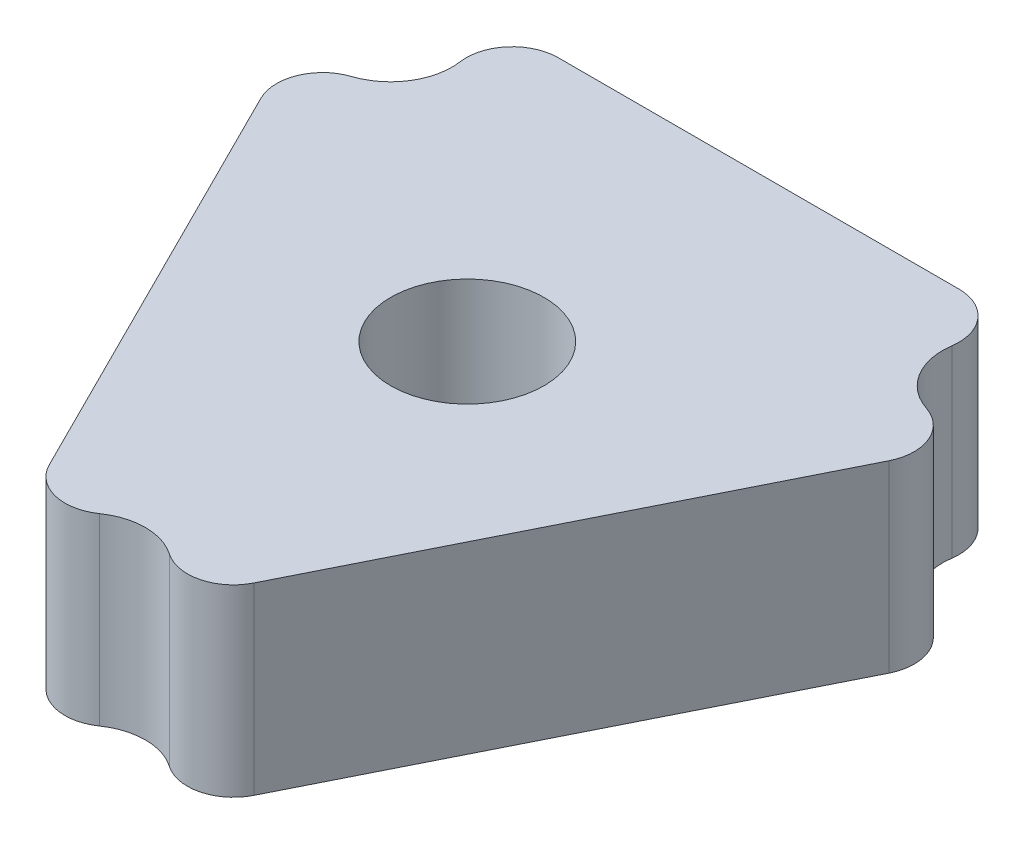
ISO-10303-21;
HEADER;
FILE_DESCRIPTION(('STEP AP214'),'2;1');
FILE_NAME('part.step','',(''),(''),'','','');
FILE_SCHEMA(('AUTOMOTIVE_DESIGN { 1 0 10303 214 1 1 1 1 }'));
ENDSEC;
DATA;
#1=APPLICATION_CONTEXT('core data for automotive mechanical design processes');
#2=APPLICATION_PROTOCOL_DEFINITION('international standard','automotive_design',2000,#1);
#3=PRODUCT_CONTEXT('',#1,'mechanical');
#4=PRODUCT('Part','Part','',(#3));
#5=PRODUCT_RELATED_PRODUCT_CATEGORY('part','',(#4));
#6=PRODUCT_DEFINITION_FORMATION('','',#4);
#7=PRODUCT_DEFINITION_CONTEXT('part definition',#1,'design');
#8=PRODUCT_DEFINITION('design','',#6,#7);
#9=PRODUCT_DEFINITION_SHAPE('','',#8);
#10=(LENGTH_UNIT() NAMED_UNIT(*) SI_UNIT(.MILLI.,.METRE.));
#11=(NAMED_UNIT(*) PLANE_ANGLE_UNIT() SI_UNIT($,.RADIAN.));
#12=(NAMED_UNIT(*) SI_UNIT($,.STERADIAN.) SOLID_ANGLE_UNIT());
#13=UNCERTAINTY_MEASURE_WITH_UNIT(LENGTH_MEASURE(1.E-05),#10,'distance_accuracy_value','');
#14=(GEOMETRIC_REPRESENTATION_CONTEXT(3) GLOBAL_UNCERTAINTY_ASSIGNED_CONTEXT((#13)) GLOBAL_UNIT_ASSIGNED_CONTEXT((#10,
#11,#12)) REPRESENTATION_CONTEXT('',''));
#15=CARTESIAN_POINT('',(0.,0.,0.));
#16=DIRECTION('',(0.,0.,1.));
#17=DIRECTION('',(1.,0.,0.));
#18=AXIS2_PLACEMENT_3D('',#15,#16,#17);
#19=CARTESIAN_POINT('',(-3.99281386796585,12.,19.2504402415681));
#20=DIRECTION('',(0.,1.,0.));
#21=DIRECTION('',(0.,0.,1.));
#22=AXIS2_PLACEMENT_3D('',#19,#20,#21);
#23=PLANE('',#22);
#24=CARTESIAN_POINT('',(-3.99281386796585,12.,19.2504402415681));
#25=DIRECTION('',(0.,1.,0.));
#26=DIRECTION('',(0.,0.,1.));
#27=AXIS2_PLACEMENT_3D('',#24,#25,#26);
#28=CIRCLE('',#27,3.);
#29=CARTESIAN_POINT('',(-6.67609544096559,12.,20.592081028068));
#30=VERTEX_POINT('',#29);
#31=CARTESIAN_POINT('',(-2.28160792455191,12.,21.7145372808961));
#32=VERTEX_POINT('',#31);
#33=EDGE_CURVE('E189',#30,#32,#28,.T.);
#34=ORIENTED_EDGE('',*,*,#33,.T.);
#35=CARTESIAN_POINT('',(0.,12.,25.));
#36=DIRECTION('',(0.,-1.,0.));
#37=DIRECTION('',(0.,0.,1.));
#38=AXIS2_PLACEMENT_3D('',#35,#36,#37);
#39=CIRCLE('',#38,4.);
#40=CARTESIAN_POINT('',(2.28160792455191,12.,21.7145372808961));
#41=VERTEX_POINT('',#40);
#42=EDGE_CURVE('E117',#32,#41,#39,.T.);
#43=ORIENTED_EDGE('',*,*,#42,.T.);
#44=CARTESIAN_POINT('',(3.99281386796585,12.,19.2504402415681));
#45=DIRECTION('',(0.,1.,0.));
#46=DIRECTION('',(0.,0.,-1.));
#47=AXIS2_PLACEMENT_3D('',#44,#45,#46);
#48=CIRCLE('',#47,3.);
#49=CARTESIAN_POINT('',(6.6760954409656,12.,20.592081028068));
#50=VERTEX_POINT('',#49);
#51=EDGE_CURVE('E216',#41,#50,#48,.T.);
#52=ORIENTED_EDGE('',*,*,#51,.T.);
#53=DIRECTION('',(0.447213595499958,0.,-0.894427190999916));
#54=VECTOR('',#53,1.);
#55=CARTESIAN_POINT('',(6.6760954409656,12.,20.592081028068));
#56=LINE('',#55,#54);
#57=CARTESIAN_POINT('',(20.4793220870337,12.,-7.0143722640683));
#58=VERTEX_POINT('',#57);
#59=EDGE_CURVE('E235',#50,#58,#56,.T.);
#60=ORIENTED_EDGE('',*,*,#59,.T.);
#61=CARTESIAN_POINT('',(17.796040514034,12.,-8.35601305056818));
#62=DIRECTION('',(0.,1.,0.));
#63=DIRECTION('',(0.,0.,-1.));
#64=AXIS2_PLACEMENT_3D('',#61,#62,#63);
#65=CIRCLE('',#64,3.);
#66=CARTESIAN_POINT('',(18.740594579448,12.,-11.2034360288961));
#67=VERTEX_POINT('',#66);
#68=EDGE_CURVE('E232',#58,#67,#65,.T.);
#69=ORIENTED_EDGE('',*,*,#68,.T.);
#70=CARTESIAN_POINT('',(20.,12.,-15.));
#71=DIRECTION('',(0.,-1.,0.));
#72=DIRECTION('',(0.,0.,1.));
#73=AXIS2_PLACEMENT_3D('',#70,#71,#72);
#74=CIRCLE('',#73,4.);
#75=CARTESIAN_POINT('',(16.0410267255568,12.,-15.5714285714286));
#76=VERTEX_POINT('',#75);
#77=EDGE_CURVE('E234',#67,#76,#74,.T.);
#78=ORIENTED_EDGE('',*,*,#77,.T.);
#79=CARTESIAN_POINT('',(13.0717967697245,12.,-16.));
#80=DIRECTION('',(0.,1.,0.));
#81=DIRECTION('',(0.,0.,-1.));
#82=AXIS2_PLACEMENT_3D('',#79,#80,#81);
#83=CIRCLE('',#82,3.);
#84=CARTESIAN_POINT('',(13.0717967697245,12.,-19.));
#85=VERTEX_POINT('',#84);
#86=EDGE_CURVE('E237',#76,#85,#83,.T.);
#87=ORIENTED_EDGE('',*,*,#86,.T.);
#88=DIRECTION('',(-1.,0.,0.));
#89=VECTOR('',#88,1.);
#90=CARTESIAN_POINT('',(13.0717967697245,12.,-19.));
#91=LINE('',#90,#89);
#92=CARTESIAN_POINT('',(-13.0717967697245,12.,-19.));
#93=VERTEX_POINT('',#92);
#94=EDGE_CURVE('E243',#85,#93,#91,.T.);
#95=ORIENTED_EDGE('',*,*,#94,.T.);
#96=CARTESIAN_POINT('',(-13.0717967697245,12.,-16.));
#97=DIRECTION('',(0.,1.,0.));
#98=DIRECTION('',(0.,0.,1.));
#99=AXIS2_PLACEMENT_3D('',#96,#97,#98);
#100=CIRCLE('',#99,3.);
#101=CARTESIAN_POINT('',(-16.0410267255569,12.,-15.5714285714286));
#102=VERTEX_POINT('',#101);
#103=EDGE_CURVE('E148',#93,#102,#100,.T.);
#104=ORIENTED_EDGE('',*,*,#103,.T.);
#105=CARTESIAN_POINT('',(-20.,12.,-15.));
#106=DIRECTION('',(0.,-1.,0.));
#107=DIRECTION('',(0.,0.,1.));
#108=AXIS2_PLACEMENT_3D('',#105,#106,#107);
#109=CIRCLE('',#108,4.);
#110=CARTESIAN_POINT('',(-18.740594579448,12.,-11.2034360288961));
#111=VERTEX_POINT('',#110);
#112=EDGE_CURVE('E142',#102,#111,#109,.T.);
#113=ORIENTED_EDGE('',*,*,#112,.T.);
#114=CARTESIAN_POINT('',(-17.796040514034,12.,-8.35601305056818));
#115=DIRECTION('',(0.,1.,0.));
#116=DIRECTION('',(0.,0.,-1.));
#117=AXIS2_PLACEMENT_3D('',#114,#115,#116);
#118=CIRCLE('',#117,3.);
#119=CARTESIAN_POINT('',(-20.4793220870337,12.,-7.0143722640683));
#120=VERTEX_POINT('',#119);
#121=EDGE_CURVE('E146',#111,#120,#118,.T.);
#122=ORIENTED_EDGE('',*,*,#121,.T.);
#123=DIRECTION('',(0.447213595499958,0.,0.894427190999916));
#124=VECTOR('',#123,1.);
#125=CARTESIAN_POINT('',(-20.4793220870337,12.,-7.0143722640683));
#126=LINE('',#125,#124);
#127=EDGE_CURVE('E62',#120,#30,#126,.T.);
#128=ORIENTED_EDGE('',*,*,#127,.T.);
#129=EDGE_LOOP('',(#34,#43,#52,#60,#69,#78,#87,#95,#104,#113,#122,#128));
#130=FACE_BOUND('',#129,.T.);
#131=CARTESIAN_POINT('',(0.,12.,0.));
#132=DIRECTION('',(0.,1.,0.));
#133=DIRECTION('',(0.,0.,1.));
#134=AXIS2_PLACEMENT_3D('',#131,#132,#133);
#135=CIRCLE('',#134,5.);
#136=CARTESIAN_POINT('',(0.,12.,5.));
#137=VERTEX_POINT('',#136);
#138=EDGE_CURVE('E170',#137,#137,#135,.T.);
#139=ORIENTED_EDGE('',*,*,#138,.F.);
#140=EDGE_LOOP('',(#139));
#141=FACE_BOUND('',#140,.T.);
#142=ADVANCED_FACE('F45',(#130,#141),#23,.T.);
#143=CARTESIAN_POINT('',(-3.99281386796585,0.,19.2504402415681));
#144=DIRECTION('',(0.,1.,0.));
#145=DIRECTION('',(0.,0.,1.));
#146=AXIS2_PLACEMENT_3D('',#143,#144,#145);
#147=PLANE('',#146);
#148=CARTESIAN_POINT('',(-3.99281386796585,0.,19.2504402415681));
#149=DIRECTION('',(0.,1.,0.));
#150=DIRECTION('',(0.,0.,1.));
#151=AXIS2_PLACEMENT_3D('',#148,#149,#150);
#152=CIRCLE('',#151,3.);
#153=CARTESIAN_POINT('',(-6.67609544096559,0.,20.592081028068));
#154=VERTEX_POINT('',#153);
#155=CARTESIAN_POINT('',(-2.28160792455191,0.,21.7145372808961));
#156=VERTEX_POINT('',#155);
#157=EDGE_CURVE('E166',#154,#156,#152,.T.);
#158=ORIENTED_EDGE('',*,*,#157,.F.);
#159=DIRECTION('',(0.447213595499958,0.,0.894427190999916));
#160=VECTOR('',#159,1.);
#161=CARTESIAN_POINT('',(-20.4793220870337,0.,-7.0143722640683));
#162=LINE('',#161,#160);
#163=CARTESIAN_POINT('',(-20.4793220870337,0.,-7.0143722640683));
#164=VERTEX_POINT('',#163);
#165=EDGE_CURVE('E109',#164,#154,#162,.T.);
#166=ORIENTED_EDGE('',*,*,#165,.F.);
#167=CARTESIAN_POINT('',(-17.796040514034,0.,-8.35601305056818));
#168=DIRECTION('',(0.,1.,0.));
#169=DIRECTION('',(0.,0.,-1.));
#170=AXIS2_PLACEMENT_3D('',#167,#168,#169);
#171=CIRCLE('',#170,3.);
#172=CARTESIAN_POINT('',(-18.740594579448,0.,-11.2034360288961));
#173=VERTEX_POINT('',#172);
#174=EDGE_CURVE('E103',#173,#164,#171,.T.);
#175=ORIENTED_EDGE('',*,*,#174,.F.);
#176=CARTESIAN_POINT('',(-20.,0.,-15.));
#177=DIRECTION('',(0.,-1.,0.));
#178=DIRECTION('',(0.,0.,1.));
#179=AXIS2_PLACEMENT_3D('',#176,#177,#178);
#180=CIRCLE('',#179,4.);
#181=CARTESIAN_POINT('',(-16.0410267255569,0.,-15.5714285714286));
#182=VERTEX_POINT('',#181);
#183=EDGE_CURVE('E156',#182,#173,#180,.T.);
#184=ORIENTED_EDGE('',*,*,#183,.F.);
#185=CARTESIAN_POINT('',(-13.0717967697245,0.,-16.));
#186=DIRECTION('',(0.,1.,0.));
#187=DIRECTION('',(0.,0.,1.));
#188=AXIS2_PLACEMENT_3D('',#185,#186,#187);
#189=CIRCLE('',#188,3.);
#190=CARTESIAN_POINT('',(-13.0717967697245,0.,-19.));
#191=VERTEX_POINT('',#190);
#192=EDGE_CURVE('E184',#191,#182,#189,.T.);
#193=ORIENTED_EDGE('',*,*,#192,.F.);
#194=DIRECTION('',(-1.,0.,0.));
#195=VECTOR('',#194,1.);
#196=CARTESIAN_POINT('',(13.0717967697245,0.,-19.));
#197=LINE('',#196,#195);
#198=CARTESIAN_POINT('',(13.0717967697245,0.,-19.));
#199=VERTEX_POINT('',#198);
#200=EDGE_CURVE('E182',#199,#191,#197,.T.);
#201=ORIENTED_EDGE('',*,*,#200,.F.);
#202=CARTESIAN_POINT('',(13.0717967697245,0.,-16.));
#203=DIRECTION('',(0.,1.,0.));
#204=DIRECTION('',(0.,0.,-1.));
#205=AXIS2_PLACEMENT_3D('',#202,#203,#204);
#206=CIRCLE('',#205,3.);
#207=CARTESIAN_POINT('',(16.0410267255568,0.,-15.5714285714286));
#208=VERTEX_POINT('',#207);
#209=EDGE_CURVE('E180',#208,#199,#206,.T.);
#210=ORIENTED_EDGE('',*,*,#209,.F.);
#211=CARTESIAN_POINT('',(20.,0.,-15.));
#212=DIRECTION('',(0.,-1.,0.));
#213=DIRECTION('',(0.,0.,1.));
#214=AXIS2_PLACEMENT_3D('',#211,#212,#213);
#215=CIRCLE('',#214,4.);
#216=CARTESIAN_POINT('',(18.740594579448,0.,-11.2034360288961));
#217=VERTEX_POINT('',#216);
#218=EDGE_CURVE('E178',#217,#208,#215,.T.);
#219=ORIENTED_EDGE('',*,*,#218,.F.);
#220=CARTESIAN_POINT('',(17.796040514034,0.,-8.35601305056818));
#221=DIRECTION('',(0.,1.,0.));
#222=DIRECTION('',(0.,0.,-1.));
#223=AXIS2_PLACEMENT_3D('',#220,#221,#222);
#224=CIRCLE('',#223,3.);
#225=CARTESIAN_POINT('',(20.4793220870337,0.,-7.0143722640683));
#226=VERTEX_POINT('',#225);
#227=EDGE_CURVE('E176',#226,#217,#224,.T.);
#228=ORIENTED_EDGE('',*,*,#227,.F.);
#229=DIRECTION('',(0.447213595499958,0.,-0.894427190999916));
#230=VECTOR('',#229,1.);
#231=CARTESIAN_POINT('',(6.6760954409656,0.,20.592081028068));
#232=LINE('',#231,#230);
#233=CARTESIAN_POINT('',(6.6760954409656,0.,20.592081028068));
#234=VERTEX_POINT('',#233);
#235=EDGE_CURVE('E174',#234,#226,#232,.T.);
#236=ORIENTED_EDGE('',*,*,#235,.F.);
#237=CARTESIAN_POINT('',(3.99281386796585,0.,19.2504402415681));
#238=DIRECTION('',(0.,1.,0.));
#239=DIRECTION('',(0.,0.,-1.));
#240=AXIS2_PLACEMENT_3D('',#237,#238,#239);
#241=CIRCLE('',#240,3.);
#242=CARTESIAN_POINT('',(2.28160792455191,0.,21.7145372808961));
#243=VERTEX_POINT('',#242);
#244=EDGE_CURVE('E172',#243,#234,#241,.T.);
#245=ORIENTED_EDGE('',*,*,#244,.F.);
#246=CARTESIAN_POINT('',(0.,0.,25.));
#247=DIRECTION('',(0.,-1.,0.));
#248=DIRECTION('',(0.,0.,1.));
#249=AXIS2_PLACEMENT_3D('',#246,#247,#248);
#250=CIRCLE('',#249,4.);
#251=EDGE_CURVE('E169',#156,#243,#250,.T.);
#252=ORIENTED_EDGE('',*,*,#251,.F.);
#253=EDGE_LOOP('',(#158,#166,#175,#184,#193,#201,#210,#219,#228,#236,#245,#252));
#254=FACE_BOUND('',#253,.T.);
#255=CARTESIAN_POINT('',(0.,0.,0.));
#256=DIRECTION('',(0.,1.,0.));
#257=DIRECTION('',(0.,0.,1.));
#258=AXIS2_PLACEMENT_3D('',#255,#256,#257);
#259=CIRCLE('',#258,5.);
#260=CARTESIAN_POINT('',(0.,0.,5.));
#261=VERTEX_POINT('',#260);
#262=EDGE_CURVE('E408',#261,#261,#259,.T.);
#263=ORIENTED_EDGE('',*,*,#262,.T.);
#264=EDGE_LOOP('',(#263));
#265=FACE_BOUND('',#264,.T.);
#266=ADVANCED_FACE('F220',(#254,#265),#147,.F.);
#267=CARTESIAN_POINT('',(-3.99281386796585,12.,19.2504402415681));
#268=DIRECTION('',(0.,-1.,0.));
#269=DIRECTION('',(0.,0.,-1.));
#270=AXIS2_PLACEMENT_3D('',#267,#268,#269);
#271=CYLINDRICAL_SURFACE('',#270,3.);
#272=ORIENTED_EDGE('',*,*,#157,.T.);
#273=DIRECTION('',(0.,-1.,0.));
#274=VECTOR('',#273,1.);
#275=CARTESIAN_POINT('',(-2.28160792455191,12.,21.7145372808961));
#276=LINE('',#275,#274);
#277=EDGE_CURVE('E13',#32,#156,#276,.T.);
#278=ORIENTED_EDGE('',*,*,#277,.F.);
#279=ORIENTED_EDGE('',*,*,#33,.F.);
#280=DIRECTION('',(0.,-1.,0.));
#281=VECTOR('',#280,1.);
#282=CARTESIAN_POINT('',(-6.67609544096559,12.,20.592081028068));
#283=LINE('',#282,#281);
#284=EDGE_CURVE('E162',#30,#154,#283,.T.);
#285=ORIENTED_EDGE('',*,*,#284,.T.);
#286=EDGE_LOOP('',(#272,#278,#279,#285));
#287=FACE_BOUND('',#286,.T.);
#288=ADVANCED_FACE('F47',(#287),#271,.T.);
#289=CARTESIAN_POINT('',(0.,12.,25.));
#290=DIRECTION('',(0.,-1.,0.));
#291=DIRECTION('',(0.,0.,-1.));
#292=AXIS2_PLACEMENT_3D('',#289,#290,#291);
#293=CYLINDRICAL_SURFACE('',#292,4.);
#294=ORIENTED_EDGE('',*,*,#251,.T.);
#295=DIRECTION('',(0.,-1.,0.));
#296=VECTOR('',#295,1.);
#297=CARTESIAN_POINT('',(2.28160792455191,12.,21.7145372808961));
#298=LINE('',#297,#296);
#299=EDGE_CURVE('E54',#41,#243,#298,.T.);
#300=ORIENTED_EDGE('',*,*,#299,.F.);
#301=ORIENTED_EDGE('',*,*,#42,.F.);
#302=ORIENTED_EDGE('',*,*,#277,.T.);
#303=EDGE_LOOP('',(#294,#300,#301,#302));
#304=FACE_BOUND('',#303,.T.);
#305=ADVANCED_FACE('F277',(#304),#293,.F.);
#306=CARTESIAN_POINT('',(3.99281386796585,12.,19.2504402415681));
#307=DIRECTION('',(0.,-1.,0.));
#308=DIRECTION('',(0.,0.,-1.));
#309=AXIS2_PLACEMENT_3D('',#306,#307,#308);
#310=CYLINDRICAL_SURFACE('',#309,3.);
#311=ORIENTED_EDGE('',*,*,#244,.T.);
#312=DIRECTION('',(0.,-1.,0.));
#313=VECTOR('',#312,1.);
#314=CARTESIAN_POINT('',(6.6760954409656,12.,20.592081028068));
#315=LINE('',#314,#313);
#316=EDGE_CURVE('E208',#50,#234,#315,.T.);
#317=ORIENTED_EDGE('',*,*,#316,.F.);
#318=ORIENTED_EDGE('',*,*,#51,.F.);
#319=ORIENTED_EDGE('',*,*,#299,.T.);
#320=EDGE_LOOP('',(#311,#317,#318,#319));
#321=FACE_BOUND('',#320,.T.);
#322=ADVANCED_FACE('F214',(#321),#310,.T.);
#323=CARTESIAN_POINT('',(6.6760954409656,12.,20.592081028068));
#324=DIRECTION('',(-0.894427190999916,0.,-0.447213595499958));
#325=DIRECTION('',(-0.447213595499958,0.,0.894427190999916));
#326=AXIS2_PLACEMENT_3D('',#323,#324,#325);
#327=PLANE('',#326);
#328=ORIENTED_EDGE('',*,*,#235,.T.);
#329=DIRECTION('',(0.,-1.,0.));
#330=VECTOR('',#329,1.);
#331=CARTESIAN_POINT('',(20.4793220870337,12.,-7.0143722640683));
#332=LINE('',#331,#330);
#333=EDGE_CURVE('E205',#58,#226,#332,.T.);
#334=ORIENTED_EDGE('',*,*,#333,.F.);
#335=ORIENTED_EDGE('',*,*,#59,.F.);
#336=ORIENTED_EDGE('',*,*,#316,.T.);
#337=EDGE_LOOP('',(#328,#334,#335,#336));
#338=FACE_BOUND('',#337,.T.);
#339=ADVANCED_FACE('F226',(#338),#327,.F.);
#340=CARTESIAN_POINT('',(17.796040514034,12.,-8.35601305056818));
#341=DIRECTION('',(0.,-1.,0.));
#342=DIRECTION('',(0.,0.,-1.));
#343=AXIS2_PLACEMENT_3D('',#340,#341,#342);
#344=CYLINDRICAL_SURFACE('',#343,3.);
#345=ORIENTED_EDGE('',*,*,#227,.T.);
#346=DIRECTION('',(0.,-1.,0.));
#347=VECTOR('',#346,1.);
#348=CARTESIAN_POINT('',(18.740594579448,12.,-11.2034360288961));
#349=LINE('',#348,#347);
#350=EDGE_CURVE('E202',#67,#217,#349,.T.);
#351=ORIENTED_EDGE('',*,*,#350,.F.);
#352=ORIENTED_EDGE('',*,*,#68,.F.);
#353=ORIENTED_EDGE('',*,*,#333,.T.);
#354=EDGE_LOOP('',(#345,#351,#352,#353));
#355=FACE_BOUND('',#354,.T.);
#356=ADVANCED_FACE('F230',(#355),#344,.T.);
#357=CARTESIAN_POINT('',(20.,12.,-15.));
#358=DIRECTION('',(0.,-1.,0.));
#359=DIRECTION('',(0.,0.,-1.));
#360=AXIS2_PLACEMENT_3D('',#357,#358,#359);
#361=CYLINDRICAL_SURFACE('',#360,4.);
#362=ORIENTED_EDGE('',*,*,#218,.T.);
#363=DIRECTION('',(0.,-1.,0.));
#364=VECTOR('',#363,1.);
#365=CARTESIAN_POINT('',(16.0410267255568,12.,-15.5714285714286));
#366=LINE('',#365,#364);
#367=EDGE_CURVE('E199',#76,#208,#366,.T.);
#368=ORIENTED_EDGE('',*,*,#367,.F.);
#369=ORIENTED_EDGE('',*,*,#77,.F.);
#370=ORIENTED_EDGE('',*,*,#350,.T.);
#371=EDGE_LOOP('',(#362,#368,#369,#370));
#372=FACE_BOUND('',#371,.T.);
#373=ADVANCED_FACE('F290',(#372),#361,.F.);
#374=CARTESIAN_POINT('',(13.0717967697245,12.,-16.));
#375=DIRECTION('',(0.,-1.,0.));
#376=DIRECTION('',(0.,0.,-1.));
#377=AXIS2_PLACEMENT_3D('',#374,#375,#376);
#378=CYLINDRICAL_SURFACE('',#377,3.);
#379=ORIENTED_EDGE('',*,*,#209,.T.);
#380=DIRECTION('',(0.,-1.,0.));
#381=VECTOR('',#380,1.);
#382=CARTESIAN_POINT('',(13.0717967697245,12.,-19.));
#383=LINE('',#382,#381);
#384=EDGE_CURVE('E196',#85,#199,#383,.T.);
#385=ORIENTED_EDGE('',*,*,#384,.F.);
#386=ORIENTED_EDGE('',*,*,#86,.F.);
#387=ORIENTED_EDGE('',*,*,#367,.T.);
#388=EDGE_LOOP('',(#379,#385,#386,#387));
#389=FACE_BOUND('',#388,.T.);
#390=ADVANCED_FACE('F293',(#389),#378,.T.);
#391=CARTESIAN_POINT('',(13.0717967697245,12.,-19.));
#392=DIRECTION('',(0.,0.,1.));
#393=DIRECTION('',(1.,0.,0.));
#394=AXIS2_PLACEMENT_3D('',#391,#392,#393);
#395=PLANE('',#394);
#396=ORIENTED_EDGE('',*,*,#200,.T.);
#397=DIRECTION('',(0.,-1.,0.));
#398=VECTOR('',#397,1.);
#399=CARTESIAN_POINT('',(-13.0717967697245,12.,-19.));
#400=LINE('',#399,#398);
#401=EDGE_CURVE('E193',#93,#191,#400,.T.);
#402=ORIENTED_EDGE('',*,*,#401,.F.);
#403=ORIENTED_EDGE('',*,*,#94,.F.);
#404=ORIENTED_EDGE('',*,*,#384,.T.);
#405=EDGE_LOOP('',(#396,#402,#403,#404));
#406=FACE_BOUND('',#405,.T.);
#407=ADVANCED_FACE('F249',(#406),#395,.F.);
#408=CARTESIAN_POINT('',(-13.0717967697245,12.,-16.));
#409=DIRECTION('',(0.,-1.,0.));
#410=DIRECTION('',(0.,0.,-1.));
#411=AXIS2_PLACEMENT_3D('',#408,#409,#410);
#412=CYLINDRICAL_SURFACE('',#411,3.);
#413=ORIENTED_EDGE('',*,*,#192,.T.);
#414=DIRECTION('',(0.,-1.,0.));
#415=VECTOR('',#414,1.);
#416=CARTESIAN_POINT('',(-16.0410267255569,12.,-15.5714285714286));
#417=LINE('',#416,#415);
#418=EDGE_CURVE('E157',#102,#182,#417,.T.);
#419=ORIENTED_EDGE('',*,*,#418,.F.);
#420=ORIENTED_EDGE('',*,*,#103,.F.);
#421=ORIENTED_EDGE('',*,*,#401,.T.);
#422=EDGE_LOOP('',(#413,#419,#420,#421));
#423=FACE_BOUND('',#422,.T.);
#424=ADVANCED_FACE('F253',(#423),#412,.T.);
#425=CARTESIAN_POINT('',(-20.,12.,-15.));
#426=DIRECTION('',(0.,-1.,0.));
#427=DIRECTION('',(0.,0.,-1.));
#428=AXIS2_PLACEMENT_3D('',#425,#426,#427);
#429=CYLINDRICAL_SURFACE('',#428,4.);
#430=ORIENTED_EDGE('',*,*,#183,.T.);
#431=DIRECTION('',(0.,-1.,0.));
#432=VECTOR('',#431,1.);
#433=CARTESIAN_POINT('',(-18.740594579448,12.,-11.2034360288961));
#434=LINE('',#433,#432);
#435=EDGE_CURVE('E153',#111,#173,#434,.T.);
#436=ORIENTED_EDGE('',*,*,#435,.F.);
#437=ORIENTED_EDGE('',*,*,#112,.F.);
#438=ORIENTED_EDGE('',*,*,#418,.T.);
#439=EDGE_LOOP('',(#430,#436,#437,#438));
#440=FACE_BOUND('',#439,.T.);
#441=ADVANCED_FACE('F154',(#440),#429,.F.);
#442=CARTESIAN_POINT('',(-17.796040514034,12.,-8.35601305056818));
#443=DIRECTION('',(0.,-1.,0.));
#444=DIRECTION('',(0.,0.,-1.));
#445=AXIS2_PLACEMENT_3D('',#442,#443,#444);
#446=CYLINDRICAL_SURFACE('',#445,3.);
#447=ORIENTED_EDGE('',*,*,#174,.T.);
#448=DIRECTION('',(0.,-1.,0.));
#449=VECTOR('',#448,1.);
#450=CARTESIAN_POINT('',(-20.4793220870337,12.,-7.0143722640683));
#451=LINE('',#450,#449);
#452=EDGE_CURVE('E158',#120,#164,#451,.T.);
#453=ORIENTED_EDGE('',*,*,#452,.F.);
#454=ORIENTED_EDGE('',*,*,#121,.F.);
#455=ORIENTED_EDGE('',*,*,#435,.T.);
#456=EDGE_LOOP('',(#447,#453,#454,#455));
#457=FACE_BOUND('',#456,.T.);
#458=ADVANCED_FACE('F160',(#457),#446,.T.);
#459=CARTESIAN_POINT('',(-20.4793220870337,12.,-7.0143722640683));
#460=DIRECTION('',(0.894427190999916,0.,-0.447213595499958));
#461=DIRECTION('',(-0.447213595499958,0.,-0.894427190999916));
#462=AXIS2_PLACEMENT_3D('',#459,#460,#461);
#463=PLANE('',#462);
#464=ORIENTED_EDGE('',*,*,#165,.T.);
#465=ORIENTED_EDGE('',*,*,#284,.F.);
#466=ORIENTED_EDGE('',*,*,#127,.F.);
#467=ORIENTED_EDGE('',*,*,#452,.T.);
#468=EDGE_LOOP('',(#464,#465,#466,#467));
#469=FACE_BOUND('',#468,.T.);
#470=ADVANCED_FACE('F257',(#469),#463,.F.);
#471=CARTESIAN_POINT('',(0.,12.,0.));
#472=DIRECTION('',(0.,-1.,0.));
#473=DIRECTION('',(0.,0.,-1.));
#474=AXIS2_PLACEMENT_3D('',#471,#472,#473);
#475=CYLINDRICAL_SURFACE('',#474,5.);
#476=ORIENTED_EDGE('',*,*,#138,.T.);
#477=EDGE_LOOP('',(#476));
#478=FACE_BOUND('',#477,.T.);
#479=ORIENTED_EDGE('',*,*,#262,.F.);
#480=EDGE_LOOP('',(#479));
#481=FACE_BOUND('',#480,.T.);
#482=ADVANCED_FACE('F259',(#478,#481),#475,.F.);
#483=CLOSED_SHELL('',(#142,#266,#288,#305,#322,#339,#356,#373,#390,#407,#424,#441,#458,#470,#482));
#484=MANIFOLD_SOLID_BREP('B2',#483);
#485=ADVANCED_BREP_SHAPE_REPRESENTATION('',(#18,#484),#14);
#486=SHAPE_DEFINITION_REPRESENTATION(#9,#485);
ENDSEC;
END-ISO-10303-21;
